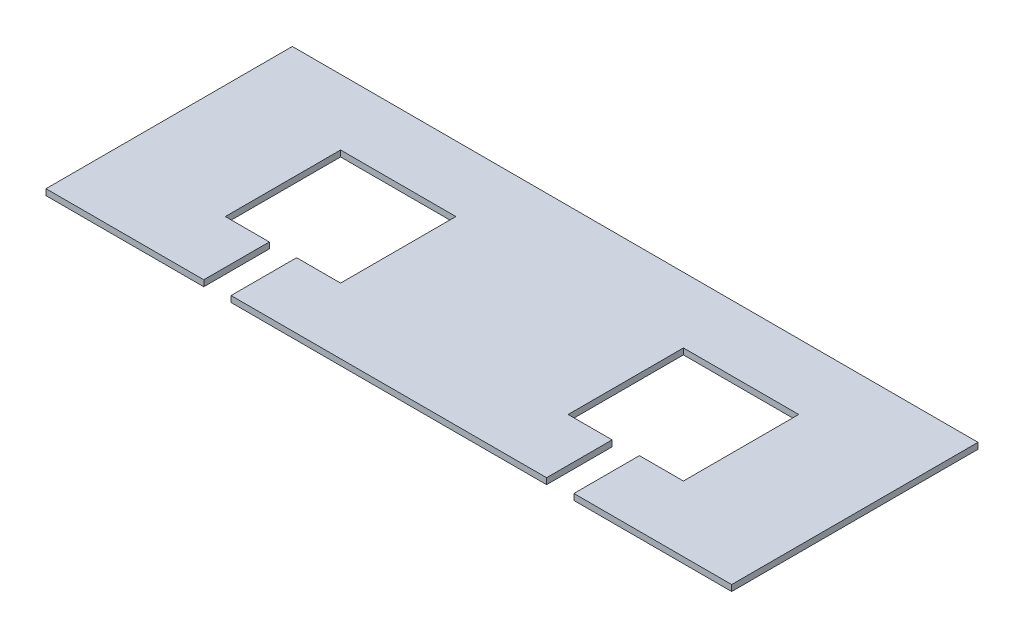
ISO-10303-21;
HEADER;
FILE_DESCRIPTION(('STEP AP214'),'2;1');
FILE_NAME('part.step','',(''),(''),'','','');
FILE_SCHEMA(('AUTOMOTIVE_DESIGN { 1 0 10303 214 1 1 1 1 }'));
ENDSEC;
DATA;
#1=APPLICATION_CONTEXT('core data for automotive mechanical design processes');
#2=APPLICATION_PROTOCOL_DEFINITION('international standard','automotive_design',2000,#1);
#3=PRODUCT_CONTEXT('',#1,'mechanical');
#4=PRODUCT('Part','Part','',(#3));
#5=PRODUCT_RELATED_PRODUCT_CATEGORY('part','',(#4));
#6=PRODUCT_DEFINITION_FORMATION('','',#4);
#7=PRODUCT_DEFINITION_CONTEXT('part definition',#1,'design');
#8=PRODUCT_DEFINITION('design','',#6,#7);
#9=PRODUCT_DEFINITION_SHAPE('','',#8);
#10=(LENGTH_UNIT() NAMED_UNIT(*) SI_UNIT(.MILLI.,.METRE.));
#11=(NAMED_UNIT(*) PLANE_ANGLE_UNIT() SI_UNIT($,.RADIAN.));
#12=(NAMED_UNIT(*) SI_UNIT($,.STERADIAN.) SOLID_ANGLE_UNIT());
#13=UNCERTAINTY_MEASURE_WITH_UNIT(LENGTH_MEASURE(1.E-05),#10,'distance_accuracy_value','');
#14=(GEOMETRIC_REPRESENTATION_CONTEXT(3) GLOBAL_UNCERTAINTY_ASSIGNED_CONTEXT((#13)) GLOBAL_UNIT_ASSIGNED_CONTEXT((#10,
#11,#12)) REPRESENTATION_CONTEXT('',''));
#15=CARTESIAN_POINT('',(0.,0.,0.));
#16=DIRECTION('',(0.,0.,1.));
#17=DIRECTION('',(1.,0.,0.));
#18=AXIS2_PLACEMENT_3D('',#15,#16,#17);
#19=CARTESIAN_POINT('',(0.,1.,0.));
#20=DIRECTION('',(0.,0.,-1.));
#21=DIRECTION('',(-1.,0.,0.));
#22=AXIS2_PLACEMENT_3D('',#19,#20,#21);
#23=PLANE('',#22);
#24=DIRECTION('',(0.,1.,0.));
#25=VECTOR('',#24,1.);
#26=CARTESIAN_POINT('',(87.,0.,0.));
#27=LINE('',#26,#25);
#28=CARTESIAN_POINT('',(87.,0.,0.));
#29=VERTEX_POINT('',#28);
#30=CARTESIAN_POINT('',(87.,1.,0.));
#31=VERTEX_POINT('',#30);
#32=EDGE_CURVE('E229',#29,#31,#27,.T.);
#33=ORIENTED_EDGE('',*,*,#32,.F.);
#34=DIRECTION('',(1.,0.,0.));
#35=VECTOR('',#34,1.);
#36=CARTESIAN_POINT('',(0.,0.,0.));
#37=LINE('',#36,#35);
#38=CARTESIAN_POINT('',(113.,0.,0.));
#39=VERTEX_POINT('',#38);
#40=EDGE_CURVE('E311',#29,#39,#37,.T.);
#41=ORIENTED_EDGE('',*,*,#40,.T.);
#42=DIRECTION('',(0.,-1.,0.));
#43=VECTOR('',#42,1.);
#44=CARTESIAN_POINT('',(113.,1.,0.));
#45=LINE('',#44,#43);
#46=CARTESIAN_POINT('',(113.,1.,0.));
#47=VERTEX_POINT('',#46);
#48=EDGE_CURVE('E45',#47,#39,#45,.T.);
#49=ORIENTED_EDGE('',*,*,#48,.F.);
#50=DIRECTION('',(1.,0.,0.));
#51=VECTOR('',#50,1.);
#52=CARTESIAN_POINT('',(0.,1.,0.));
#53=LINE('',#52,#51);
#54=EDGE_CURVE('E298',#31,#47,#53,.T.);
#55=ORIENTED_EDGE('',*,*,#54,.F.);
#56=EDGE_LOOP('',(#33,#41,#49,#55));
#57=FACE_BOUND('',#56,.T.);
#58=ADVANCED_FACE('F37',(#57),#23,.F.);
#59=DIRECTION('',(0.,1.,0.));
#60=VECTOR('',#59,1.);
#61=CARTESIAN_POINT('',(82.5,0.,0.));
#62=LINE('',#61,#60);
#63=CARTESIAN_POINT('',(82.5,0.,0.));
#64=VERTEX_POINT('',#63);
#65=CARTESIAN_POINT('',(82.5,1.,0.));
#66=VERTEX_POINT('',#65);
#67=EDGE_CURVE('E231',#64,#66,#62,.T.);
#68=ORIENTED_EDGE('',*,*,#67,.T.);
#69=CARTESIAN_POINT('',(30.5,1.,0.));
#70=VERTEX_POINT('',#69);
#71=EDGE_CURVE('E304',#70,#66,#53,.T.);
#72=ORIENTED_EDGE('',*,*,#71,.F.);
#73=DIRECTION('',(0.,1.,0.));
#74=VECTOR('',#73,1.);
#75=CARTESIAN_POINT('',(30.5,0.,0.));
#76=LINE('',#75,#74);
#77=CARTESIAN_POINT('',(30.5,0.,0.));
#78=VERTEX_POINT('',#77);
#79=EDGE_CURVE('E287',#78,#70,#76,.T.);
#80=ORIENTED_EDGE('',*,*,#79,.F.);
#81=EDGE_CURVE('E316',#78,#64,#37,.T.);
#82=ORIENTED_EDGE('',*,*,#81,.T.);
#83=EDGE_LOOP('',(#68,#72,#80,#82));
#84=FACE_BOUND('',#83,.T.);
#85=ADVANCED_FACE('F352',(#84),#23,.F.);
#86=CARTESIAN_POINT('',(0.,1.,0.));
#87=DIRECTION('',(0.,-1.,0.));
#88=DIRECTION('',(0.,0.,-1.));
#89=AXIS2_PLACEMENT_3D('',#86,#87,#88);
#90=PLANE('',#89);
#91=DIRECTION('',(0.,0.,1.));
#92=VECTOR('',#91,1.);
#93=CARTESIAN_POINT('',(87.,1.,-10.8));
#94=LINE('',#93,#92);
#95=CARTESIAN_POINT('',(87.,1.,-10.8));
#96=VERTEX_POINT('',#95);
#97=EDGE_CURVE('E199',#96,#31,#94,.T.);
#98=ORIENTED_EDGE('',*,*,#97,.T.);
#99=ORIENTED_EDGE('',*,*,#54,.T.);
#100=DIRECTION('',(0.,0.,-1.));
#101=VECTOR('',#100,1.);
#102=CARTESIAN_POINT('',(113.,1.,0.));
#103=LINE('',#102,#101);
#104=CARTESIAN_POINT('',(113.,1.,-40.6));
#105=VERTEX_POINT('',#104);
#106=EDGE_CURVE('E303',#47,#105,#103,.T.);
#107=ORIENTED_EDGE('',*,*,#106,.T.);
#108=DIRECTION('',(-1.,0.,0.));
#109=VECTOR('',#108,1.);
#110=CARTESIAN_POINT('',(0.,1.,-40.6));
#111=LINE('',#110,#109);
#112=CARTESIAN_POINT('',(0.,1.,-40.6));
#113=VERTEX_POINT('',#112);
#114=EDGE_CURVE('E306',#105,#113,#111,.T.);
#115=ORIENTED_EDGE('',*,*,#114,.T.);
#116=DIRECTION('',(0.,0.,1.));
#117=VECTOR('',#116,1.);
#118=CARTESIAN_POINT('',(0.,1.,0.));
#119=LINE('',#118,#117);
#120=CARTESIAN_POINT('',(0.,1.,0.));
#121=VERTEX_POINT('',#120);
#122=EDGE_CURVE('E295',#113,#121,#119,.T.);
#123=ORIENTED_EDGE('',*,*,#122,.T.);
#124=CARTESIAN_POINT('',(26.,1.,0.));
#125=VERTEX_POINT('',#124);
#126=EDGE_CURVE('E300',#121,#125,#53,.T.);
#127=ORIENTED_EDGE('',*,*,#126,.T.);
#128=DIRECTION('',(0.,0.,1.));
#129=VECTOR('',#128,1.);
#130=CARTESIAN_POINT('',(26.,1.,-10.8));
#131=LINE('',#130,#129);
#132=CARTESIAN_POINT('',(26.,1.,-10.8));
#133=VERTEX_POINT('',#132);
#134=EDGE_CURVE('E265',#133,#125,#131,.T.);
#135=ORIENTED_EDGE('',*,*,#134,.F.);
#136=DIRECTION('',(1.,0.,0.));
#137=VECTOR('',#136,1.);
#138=CARTESIAN_POINT('',(26.,1.,-10.8));
#139=LINE('',#138,#137);
#140=CARTESIAN_POINT('',(18.75,1.,-10.8));
#141=VERTEX_POINT('',#140);
#142=EDGE_CURVE('E262',#141,#133,#139,.T.);
#143=ORIENTED_EDGE('',*,*,#142,.F.);
#144=DIRECTION('',(0.,0.,1.));
#145=VECTOR('',#144,1.);
#146=CARTESIAN_POINT('',(18.75,1.,-10.8));
#147=LINE('',#146,#145);
#148=CARTESIAN_POINT('',(18.75,1.,-29.8));
#149=VERTEX_POINT('',#148);
#150=EDGE_CURVE('E226',#149,#141,#147,.T.);
#151=ORIENTED_EDGE('',*,*,#150,.F.);
#152=DIRECTION('',(-1.,0.,0.));
#153=VECTOR('',#152,1.);
#154=CARTESIAN_POINT('',(37.75,1.,-29.8));
#155=LINE('',#154,#153);
#156=CARTESIAN_POINT('',(37.75,1.,-29.8));
#157=VERTEX_POINT('',#156);
#158=EDGE_CURVE('E243',#157,#149,#155,.T.);
#159=ORIENTED_EDGE('',*,*,#158,.F.);
#160=DIRECTION('',(0.,0.,-1.));
#161=VECTOR('',#160,1.);
#162=CARTESIAN_POINT('',(37.75,1.,-10.8));
#163=LINE('',#162,#161);
#164=CARTESIAN_POINT('',(37.75,1.,-10.8));
#165=VERTEX_POINT('',#164);
#166=EDGE_CURVE('E273',#165,#157,#163,.T.);
#167=ORIENTED_EDGE('',*,*,#166,.F.);
#168=DIRECTION('',(1.,0.,0.));
#169=VECTOR('',#168,1.);
#170=CARTESIAN_POINT('',(37.75,1.,-10.8));
#171=LINE('',#170,#169);
#172=CARTESIAN_POINT('',(30.5,1.,-10.8));
#173=VERTEX_POINT('',#172);
#174=EDGE_CURVE('E270',#173,#165,#171,.T.);
#175=ORIENTED_EDGE('',*,*,#174,.F.);
#176=DIRECTION('',(0.,0.,-1.));
#177=VECTOR('',#176,1.);
#178=CARTESIAN_POINT('',(30.5,1.,-10.8));
#179=LINE('',#178,#177);
#180=EDGE_CURVE('E267',#70,#173,#179,.T.);
#181=ORIENTED_EDGE('',*,*,#180,.F.);
#182=ORIENTED_EDGE('',*,*,#71,.T.);
#183=DIRECTION('',(0.,0.,-1.));
#184=VECTOR('',#183,1.);
#185=CARTESIAN_POINT('',(82.5,1.,-10.8));
#186=LINE('',#185,#184);
#187=CARTESIAN_POINT('',(82.5,1.,-10.8));
#188=VERTEX_POINT('',#187);
#189=EDGE_CURVE('E219',#66,#188,#186,.T.);
#190=ORIENTED_EDGE('',*,*,#189,.T.);
#191=DIRECTION('',(-1.,0.,0.));
#192=VECTOR('',#191,1.);
#193=CARTESIAN_POINT('',(75.25,1.,-10.8));
#194=LINE('',#193,#192);
#195=CARTESIAN_POINT('',(75.25,1.,-10.8));
#196=VERTEX_POINT('',#195);
#197=EDGE_CURVE('E216',#188,#196,#194,.T.);
#198=ORIENTED_EDGE('',*,*,#197,.T.);
#199=DIRECTION('',(0.,0.,-1.));
#200=VECTOR('',#199,1.);
#201=CARTESIAN_POINT('',(75.25,1.,-10.8));
#202=LINE('',#201,#200);
#203=CARTESIAN_POINT('',(75.25,1.,-29.8));
#204=VERTEX_POINT('',#203);
#205=EDGE_CURVE('E213',#196,#204,#202,.T.);
#206=ORIENTED_EDGE('',*,*,#205,.T.);
#207=DIRECTION('',(1.,0.,0.));
#208=VECTOR('',#207,1.);
#209=CARTESIAN_POINT('',(75.25,1.,-29.8));
#210=LINE('',#209,#208);
#211=CARTESIAN_POINT('',(94.25,1.,-29.8));
#212=VERTEX_POINT('',#211);
#213=EDGE_CURVE('E211',#204,#212,#210,.T.);
#214=ORIENTED_EDGE('',*,*,#213,.T.);
#215=DIRECTION('',(0.,0.,1.));
#216=VECTOR('',#215,1.);
#217=CARTESIAN_POINT('',(94.25,1.,-10.8));
#218=LINE('',#217,#216);
#219=CARTESIAN_POINT('',(94.25,1.,-10.8));
#220=VERTEX_POINT('',#219);
#221=EDGE_CURVE('E188',#212,#220,#218,.T.);
#222=ORIENTED_EDGE('',*,*,#221,.T.);
#223=DIRECTION('',(-1.,0.,0.));
#224=VECTOR('',#223,1.);
#225=CARTESIAN_POINT('',(87.,1.,-10.8));
#226=LINE('',#225,#224);
#227=EDGE_CURVE('E196',#220,#96,#226,.T.);
#228=ORIENTED_EDGE('',*,*,#227,.T.);
#229=EDGE_LOOP('',(#98,#99,#107,#115,#123,#127,#135,#143,#151,#159,#167,#175,#181,#182,#190,
#198,#206,#214,#222,#228));
#230=FACE_BOUND('',#229,.T.);
#231=ADVANCED_FACE('F342',(#230),#90,.F.);
#232=CARTESIAN_POINT('',(0.,0.,0.));
#233=DIRECTION('',(0.,-1.,0.));
#234=DIRECTION('',(0.,0.,-1.));
#235=AXIS2_PLACEMENT_3D('',#232,#233,#234);
#236=PLANE('',#235);
#237=ORIENTED_EDGE('',*,*,#40,.F.);
#238=DIRECTION('',(0.,0.,1.));
#239=VECTOR('',#238,1.);
#240=CARTESIAN_POINT('',(87.,0.,-10.8));
#241=LINE('',#240,#239);
#242=CARTESIAN_POINT('',(87.,0.,-10.8));
#243=VERTEX_POINT('',#242);
#244=EDGE_CURVE('E207',#243,#29,#241,.T.);
#245=ORIENTED_EDGE('',*,*,#244,.F.);
#246=DIRECTION('',(-1.,0.,0.));
#247=VECTOR('',#246,1.);
#248=CARTESIAN_POINT('',(87.,0.,-10.8));
#249=LINE('',#248,#247);
#250=CARTESIAN_POINT('',(94.25,0.,-10.8));
#251=VERTEX_POINT('',#250);
#252=EDGE_CURVE('E190',#251,#243,#249,.T.);
#253=ORIENTED_EDGE('',*,*,#252,.F.);
#254=DIRECTION('',(0.,0.,1.));
#255=VECTOR('',#254,1.);
#256=CARTESIAN_POINT('',(94.25,0.,-10.8));
#257=LINE('',#256,#255);
#258=CARTESIAN_POINT('',(94.25,0.,-29.8));
#259=VERTEX_POINT('',#258);
#260=EDGE_CURVE('E181',#259,#251,#257,.T.);
#261=ORIENTED_EDGE('',*,*,#260,.F.);
#262=DIRECTION('',(1.,0.,0.));
#263=VECTOR('',#262,1.);
#264=CARTESIAN_POINT('',(75.25,0.,-29.8));
#265=LINE('',#264,#263);
#266=CARTESIAN_POINT('',(75.25,0.,-29.8));
#267=VERTEX_POINT('',#266);
#268=EDGE_CURVE('E172',#267,#259,#265,.T.);
#269=ORIENTED_EDGE('',*,*,#268,.F.);
#270=DIRECTION('',(0.,0.,-1.));
#271=VECTOR('',#270,1.);
#272=CARTESIAN_POINT('',(75.25,0.,-10.8));
#273=LINE('',#272,#271);
#274=CARTESIAN_POINT('',(75.25,0.,-10.8));
#275=VERTEX_POINT('',#274);
#276=EDGE_CURVE('E180',#275,#267,#273,.T.);
#277=ORIENTED_EDGE('',*,*,#276,.F.);
#278=DIRECTION('',(-1.,0.,0.));
#279=VECTOR('',#278,1.);
#280=CARTESIAN_POINT('',(75.25,0.,-10.8));
#281=LINE('',#280,#279);
#282=CARTESIAN_POINT('',(82.5,0.,-10.8));
#283=VERTEX_POINT('',#282);
#284=EDGE_CURVE('E203',#283,#275,#281,.T.);
#285=ORIENTED_EDGE('',*,*,#284,.F.);
#286=DIRECTION('',(0.,0.,-1.));
#287=VECTOR('',#286,1.);
#288=CARTESIAN_POINT('',(82.5,0.,-10.8));
#289=LINE('',#288,#287);
#290=EDGE_CURVE('E205',#64,#283,#289,.T.);
#291=ORIENTED_EDGE('',*,*,#290,.F.);
#292=ORIENTED_EDGE('',*,*,#81,.F.);
#293=DIRECTION('',(0.,0.,-1.));
#294=VECTOR('',#293,1.);
#295=CARTESIAN_POINT('',(30.5,0.,-10.8));
#296=LINE('',#295,#294);
#297=CARTESIAN_POINT('',(30.5,0.,-10.8));
#298=VERTEX_POINT('',#297);
#299=EDGE_CURVE('E247',#78,#298,#296,.T.);
#300=ORIENTED_EDGE('',*,*,#299,.T.);
#301=DIRECTION('',(1.,0.,0.));
#302=VECTOR('',#301,1.);
#303=CARTESIAN_POINT('',(37.75,0.,-10.8));
#304=LINE('',#303,#302);
#305=CARTESIAN_POINT('',(37.75,0.,-10.8));
#306=VERTEX_POINT('',#305);
#307=EDGE_CURVE('E250',#298,#306,#304,.T.);
#308=ORIENTED_EDGE('',*,*,#307,.T.);
#309=DIRECTION('',(0.,0.,-1.));
#310=VECTOR('',#309,1.);
#311=CARTESIAN_POINT('',(37.75,0.,-10.8));
#312=LINE('',#311,#310);
#313=CARTESIAN_POINT('',(37.75,0.,-29.8));
#314=VERTEX_POINT('',#313);
#315=EDGE_CURVE('E253',#306,#314,#312,.T.);
#316=ORIENTED_EDGE('',*,*,#315,.T.);
#317=DIRECTION('',(-1.,0.,0.));
#318=VECTOR('',#317,1.);
#319=CARTESIAN_POINT('',(37.75,0.,-29.8));
#320=LINE('',#319,#318);
#321=CARTESIAN_POINT('',(18.75,0.,-29.8));
#322=VERTEX_POINT('',#321);
#323=EDGE_CURVE('E256',#314,#322,#320,.T.);
#324=ORIENTED_EDGE('',*,*,#323,.T.);
#325=DIRECTION('',(0.,0.,1.));
#326=VECTOR('',#325,1.);
#327=CARTESIAN_POINT('',(18.75,0.,-10.8));
#328=LINE('',#327,#326);
#329=CARTESIAN_POINT('',(18.75,0.,-10.8));
#330=VERTEX_POINT('',#329);
#331=EDGE_CURVE('E239',#322,#330,#328,.T.);
#332=ORIENTED_EDGE('',*,*,#331,.T.);
#333=DIRECTION('',(1.,0.,0.));
#334=VECTOR('',#333,1.);
#335=CARTESIAN_POINT('',(26.,0.,-10.8));
#336=LINE('',#335,#334);
#337=CARTESIAN_POINT('',(26.,0.,-10.8));
#338=VERTEX_POINT('',#337);
#339=EDGE_CURVE('E242',#330,#338,#336,.T.);
#340=ORIENTED_EDGE('',*,*,#339,.T.);
#341=DIRECTION('',(0.,0.,1.));
#342=VECTOR('',#341,1.);
#343=CARTESIAN_POINT('',(26.,0.,-10.8));
#344=LINE('',#343,#342);
#345=CARTESIAN_POINT('',(26.,0.,0.));
#346=VERTEX_POINT('',#345);
#347=EDGE_CURVE('E60',#338,#346,#344,.T.);
#348=ORIENTED_EDGE('',*,*,#347,.T.);
#349=CARTESIAN_POINT('',(0.,0.,0.));
#350=VERTEX_POINT('',#349);
#351=EDGE_CURVE('E312',#350,#346,#37,.T.);
#352=ORIENTED_EDGE('',*,*,#351,.F.);
#353=DIRECTION('',(0.,0.,1.));
#354=VECTOR('',#353,1.);
#355=CARTESIAN_POINT('',(0.,0.,0.));
#356=LINE('',#355,#354);
#357=CARTESIAN_POINT('',(0.,0.,-40.6));
#358=VERTEX_POINT('',#357);
#359=EDGE_CURVE('E280',#358,#350,#356,.T.);
#360=ORIENTED_EDGE('',*,*,#359,.F.);
#361=DIRECTION('',(-1.,0.,0.));
#362=VECTOR('',#361,1.);
#363=CARTESIAN_POINT('',(0.,0.,-40.6));
#364=LINE('',#363,#362);
#365=CARTESIAN_POINT('',(113.,0.,-40.6));
#366=VERTEX_POINT('',#365);
#367=EDGE_CURVE('E299',#366,#358,#364,.T.);
#368=ORIENTED_EDGE('',*,*,#367,.F.);
#369=DIRECTION('',(0.,0.,-1.));
#370=VECTOR('',#369,1.);
#371=CARTESIAN_POINT('',(113.,0.,0.));
#372=LINE('',#371,#370);
#373=EDGE_CURVE('E315',#39,#366,#372,.T.);
#374=ORIENTED_EDGE('',*,*,#373,.F.);
#375=EDGE_LOOP('',(#237,#245,#253,#261,#269,#277,#285,#291,#292,#300,#308,#316,#324,#332,#340,
#348,#352,#360,#368,#374));
#376=FACE_BOUND('',#375,.T.);
#377=ADVANCED_FACE('F194',(#376),#236,.T.);
#378=CARTESIAN_POINT('',(0.,1.,0.));
#379=DIRECTION('',(1.,0.,0.));
#380=DIRECTION('',(0.,0.,-1.));
#381=AXIS2_PLACEMENT_3D('',#378,#379,#380);
#382=PLANE('',#381);
#383=ORIENTED_EDGE('',*,*,#359,.T.);
#384=DIRECTION('',(0.,-1.,0.));
#385=VECTOR('',#384,1.);
#386=CARTESIAN_POINT('',(0.,1.,0.));
#387=LINE('',#386,#385);
#388=EDGE_CURVE('E11',#121,#350,#387,.T.);
#389=ORIENTED_EDGE('',*,*,#388,.F.);
#390=ORIENTED_EDGE('',*,*,#122,.F.);
#391=DIRECTION('',(0.,-1.,0.));
#392=VECTOR('',#391,1.);
#393=CARTESIAN_POINT('',(0.,1.,-40.6));
#394=LINE('',#393,#392);
#395=EDGE_CURVE('E308',#113,#358,#394,.T.);
#396=ORIENTED_EDGE('',*,*,#395,.T.);
#397=EDGE_LOOP('',(#383,#389,#390,#396));
#398=FACE_BOUND('',#397,.T.);
#399=ADVANCED_FACE('F39',(#398),#382,.F.);
#400=ORIENTED_EDGE('',*,*,#351,.T.);
#401=DIRECTION('',(0.,1.,0.));
#402=VECTOR('',#401,1.);
#403=CARTESIAN_POINT('',(26.,0.,0.));
#404=LINE('',#403,#402);
#405=EDGE_CURVE('E289',#346,#125,#404,.T.);
#406=ORIENTED_EDGE('',*,*,#405,.T.);
#407=ORIENTED_EDGE('',*,*,#126,.F.);
#408=ORIENTED_EDGE('',*,*,#388,.T.);
#409=EDGE_LOOP('',(#400,#406,#407,#408));
#410=FACE_BOUND('',#409,.T.);
#411=ADVANCED_FACE('F373',(#410),#23,.F.);
#412=CARTESIAN_POINT('',(113.,1.,0.));
#413=DIRECTION('',(-1.,0.,0.));
#414=DIRECTION('',(0.,0.,1.));
#415=AXIS2_PLACEMENT_3D('',#412,#413,#414);
#416=PLANE('',#415);
#417=ORIENTED_EDGE('',*,*,#373,.T.);
#418=DIRECTION('',(0.,-1.,0.));
#419=VECTOR('',#418,1.);
#420=CARTESIAN_POINT('',(113.,1.,-40.6));
#421=LINE('',#420,#419);
#422=EDGE_CURVE('E321',#105,#366,#421,.T.);
#423=ORIENTED_EDGE('',*,*,#422,.F.);
#424=ORIENTED_EDGE('',*,*,#106,.F.);
#425=ORIENTED_EDGE('',*,*,#48,.T.);
#426=EDGE_LOOP('',(#417,#423,#424,#425));
#427=FACE_BOUND('',#426,.T.);
#428=ADVANCED_FACE('F328',(#427),#416,.F.);
#429=CARTESIAN_POINT('',(0.,1.,-40.6));
#430=DIRECTION('',(0.,0.,1.));
#431=DIRECTION('',(1.,0.,0.));
#432=AXIS2_PLACEMENT_3D('',#429,#430,#431);
#433=PLANE('',#432);
#434=ORIENTED_EDGE('',*,*,#367,.T.);
#435=ORIENTED_EDGE('',*,*,#395,.F.);
#436=ORIENTED_EDGE('',*,*,#114,.F.);
#437=ORIENTED_EDGE('',*,*,#422,.T.);
#438=EDGE_LOOP('',(#434,#435,#436,#437));
#439=FACE_BOUND('',#438,.T.);
#440=ADVANCED_FACE('F336',(#439),#433,.F.);
#441=CARTESIAN_POINT('',(18.75,0.,-10.8));
#442=DIRECTION('',(-1.,0.,0.));
#443=DIRECTION('',(0.,0.,1.));
#444=AXIS2_PLACEMENT_3D('',#441,#442,#443);
#445=PLANE('',#444);
#446=ORIENTED_EDGE('',*,*,#150,.T.);
#447=DIRECTION('',(0.,1.,0.));
#448=VECTOR('',#447,1.);
#449=CARTESIAN_POINT('',(18.75,0.,-10.8));
#450=LINE('',#449,#448);
#451=EDGE_CURVE('E259',#330,#141,#450,.T.);
#452=ORIENTED_EDGE('',*,*,#451,.F.);
#453=ORIENTED_EDGE('',*,*,#331,.F.);
#454=DIRECTION('',(0.,1.,0.));
#455=VECTOR('',#454,1.);
#456=CARTESIAN_POINT('',(18.75,0.,-29.8));
#457=LINE('',#456,#455);
#458=EDGE_CURVE('E278',#322,#149,#457,.T.);
#459=ORIENTED_EDGE('',*,*,#458,.T.);
#460=EDGE_LOOP('',(#446,#452,#453,#459));
#461=FACE_BOUND('',#460,.T.);
#462=ADVANCED_FACE('F394',(#461),#445,.F.);
#463=CARTESIAN_POINT('',(37.75,0.,-29.8));
#464=DIRECTION('',(0.,0.,-1.));
#465=DIRECTION('',(-1.,0.,0.));
#466=AXIS2_PLACEMENT_3D('',#463,#464,#465);
#467=PLANE('',#466);
#468=ORIENTED_EDGE('',*,*,#158,.T.);
#469=ORIENTED_EDGE('',*,*,#458,.F.);
#470=ORIENTED_EDGE('',*,*,#323,.F.);
#471=DIRECTION('',(0.,1.,0.));
#472=VECTOR('',#471,1.);
#473=CARTESIAN_POINT('',(37.75,0.,-29.8));
#474=LINE('',#473,#472);
#475=EDGE_CURVE('E281',#314,#157,#474,.T.);
#476=ORIENTED_EDGE('',*,*,#475,.T.);
#477=EDGE_LOOP('',(#468,#469,#470,#476));
#478=FACE_BOUND('',#477,.T.);
#479=ADVANCED_FACE('F397',(#478),#467,.F.);
#480=CARTESIAN_POINT('',(37.75,0.,-10.8));
#481=DIRECTION('',(1.,0.,0.));
#482=DIRECTION('',(0.,0.,-1.));
#483=AXIS2_PLACEMENT_3D('',#480,#481,#482);
#484=PLANE('',#483);
#485=ORIENTED_EDGE('',*,*,#166,.T.);
#486=ORIENTED_EDGE('',*,*,#475,.F.);
#487=ORIENTED_EDGE('',*,*,#315,.F.);
#488=DIRECTION('',(0.,1.,0.));
#489=VECTOR('',#488,1.);
#490=CARTESIAN_POINT('',(37.75,0.,-10.8));
#491=LINE('',#490,#489);
#492=EDGE_CURVE('E283',#306,#165,#491,.T.);
#493=ORIENTED_EDGE('',*,*,#492,.T.);
#494=EDGE_LOOP('',(#485,#486,#487,#493));
#495=FACE_BOUND('',#494,.T.);
#496=ADVANCED_FACE('F400',(#495),#484,.F.);
#497=CARTESIAN_POINT('',(37.75,0.,-10.8));
#498=DIRECTION('',(0.,0.,1.));
#499=DIRECTION('',(1.,0.,0.));
#500=AXIS2_PLACEMENT_3D('',#497,#498,#499);
#501=PLANE('',#500);
#502=ORIENTED_EDGE('',*,*,#174,.T.);
#503=ORIENTED_EDGE('',*,*,#492,.F.);
#504=ORIENTED_EDGE('',*,*,#307,.F.);
#505=DIRECTION('',(0.,1.,0.));
#506=VECTOR('',#505,1.);
#507=CARTESIAN_POINT('',(30.5,0.,-10.8));
#508=LINE('',#507,#506);
#509=EDGE_CURVE('E285',#298,#173,#508,.T.);
#510=ORIENTED_EDGE('',*,*,#509,.T.);
#511=EDGE_LOOP('',(#502,#503,#504,#510));
#512=FACE_BOUND('',#511,.T.);
#513=ADVANCED_FACE('F402',(#512),#501,.F.);
#514=CARTESIAN_POINT('',(30.5,0.,-10.8));
#515=DIRECTION('',(1.,0.,0.));
#516=DIRECTION('',(0.,0.,-1.));
#517=AXIS2_PLACEMENT_3D('',#514,#515,#516);
#518=PLANE('',#517);
#519=ORIENTED_EDGE('',*,*,#180,.T.);
#520=ORIENTED_EDGE('',*,*,#509,.F.);
#521=ORIENTED_EDGE('',*,*,#299,.F.);
#522=ORIENTED_EDGE('',*,*,#79,.T.);
#523=EDGE_LOOP('',(#519,#520,#521,#522));
#524=FACE_BOUND('',#523,.T.);
#525=ADVANCED_FACE('F405',(#524),#518,.F.);
#526=CARTESIAN_POINT('',(26.,0.,-10.8));
#527=DIRECTION('',(-1.,0.,0.));
#528=DIRECTION('',(0.,0.,1.));
#529=AXIS2_PLACEMENT_3D('',#526,#527,#528);
#530=PLANE('',#529);
#531=ORIENTED_EDGE('',*,*,#134,.T.);
#532=ORIENTED_EDGE('',*,*,#405,.F.);
#533=ORIENTED_EDGE('',*,*,#347,.F.);
#534=DIRECTION('',(0.,1.,0.));
#535=VECTOR('',#534,1.);
#536=CARTESIAN_POINT('',(26.,0.,-10.8));
#537=LINE('',#536,#535);
#538=EDGE_CURVE('E292',#338,#133,#537,.T.);
#539=ORIENTED_EDGE('',*,*,#538,.T.);
#540=EDGE_LOOP('',(#531,#532,#533,#539));
#541=FACE_BOUND('',#540,.T.);
#542=ADVANCED_FACE('F389',(#541),#530,.F.);
#543=CARTESIAN_POINT('',(26.,0.,-10.8));
#544=DIRECTION('',(0.,0.,1.));
#545=DIRECTION('',(1.,0.,0.));
#546=AXIS2_PLACEMENT_3D('',#543,#544,#545);
#547=PLANE('',#546);
#548=ORIENTED_EDGE('',*,*,#142,.T.);
#549=ORIENTED_EDGE('',*,*,#538,.F.);
#550=ORIENTED_EDGE('',*,*,#339,.F.);
#551=ORIENTED_EDGE('',*,*,#451,.T.);
#552=EDGE_LOOP('',(#548,#549,#550,#551));
#553=FACE_BOUND('',#552,.T.);
#554=ADVANCED_FACE('F387',(#553),#547,.F.);
#555=CARTESIAN_POINT('',(94.25,0.,-10.8));
#556=DIRECTION('',(-1.,0.,0.));
#557=DIRECTION('',(0.,0.,1.));
#558=AXIS2_PLACEMENT_3D('',#555,#556,#557);
#559=PLANE('',#558);
#560=ORIENTED_EDGE('',*,*,#221,.F.);
#561=DIRECTION('',(0.,1.,0.));
#562=VECTOR('',#561,1.);
#563=CARTESIAN_POINT('',(94.25,0.,-29.8));
#564=LINE('',#563,#562);
#565=EDGE_CURVE('E175',#259,#212,#564,.T.);
#566=ORIENTED_EDGE('',*,*,#565,.F.);
#567=ORIENTED_EDGE('',*,*,#260,.T.);
#568=DIRECTION('',(0.,1.,0.));
#569=VECTOR('',#568,1.);
#570=CARTESIAN_POINT('',(94.25,0.,-10.8));
#571=LINE('',#570,#569);
#572=EDGE_CURVE('E224',#251,#220,#571,.T.);
#573=ORIENTED_EDGE('',*,*,#572,.T.);
#574=EDGE_LOOP('',(#560,#566,#567,#573));
#575=FACE_BOUND('',#574,.T.);
#576=ADVANCED_FACE('F184',(#575),#559,.T.);
#577=CARTESIAN_POINT('',(87.,0.,-10.8));
#578=DIRECTION('',(0.,0.,-1.));
#579=DIRECTION('',(-1.,0.,0.));
#580=AXIS2_PLACEMENT_3D('',#577,#578,#579);
#581=PLANE('',#580);
#582=ORIENTED_EDGE('',*,*,#227,.F.);
#583=ORIENTED_EDGE('',*,*,#572,.F.);
#584=ORIENTED_EDGE('',*,*,#252,.T.);
#585=DIRECTION('',(0.,1.,0.));
#586=VECTOR('',#585,1.);
#587=CARTESIAN_POINT('',(87.,0.,-10.8));
#588=LINE('',#587,#586);
#589=EDGE_CURVE('E227',#243,#96,#588,.T.);
#590=ORIENTED_EDGE('',*,*,#589,.T.);
#591=EDGE_LOOP('',(#582,#583,#584,#590));
#592=FACE_BOUND('',#591,.T.);
#593=ADVANCED_FACE('F368',(#592),#581,.T.);
#594=CARTESIAN_POINT('',(87.,0.,-10.8));
#595=DIRECTION('',(-1.,0.,0.));
#596=DIRECTION('',(0.,0.,1.));
#597=AXIS2_PLACEMENT_3D('',#594,#595,#596);
#598=PLANE('',#597);
#599=ORIENTED_EDGE('',*,*,#97,.F.);
#600=ORIENTED_EDGE('',*,*,#589,.F.);
#601=ORIENTED_EDGE('',*,*,#244,.T.);
#602=ORIENTED_EDGE('',*,*,#32,.T.);
#603=EDGE_LOOP('',(#599,#600,#601,#602));
#604=FACE_BOUND('',#603,.T.);
#605=ADVANCED_FACE('F371',(#604),#598,.T.);
#606=CARTESIAN_POINT('',(82.5,0.,-10.8));
#607=DIRECTION('',(1.,0.,0.));
#608=DIRECTION('',(0.,0.,-1.));
#609=AXIS2_PLACEMENT_3D('',#606,#607,#608);
#610=PLANE('',#609);
#611=ORIENTED_EDGE('',*,*,#189,.F.);
#612=ORIENTED_EDGE('',*,*,#67,.F.);
#613=ORIENTED_EDGE('',*,*,#290,.T.);
#614=DIRECTION('',(0.,1.,0.));
#615=VECTOR('',#614,1.);
#616=CARTESIAN_POINT('',(82.5,0.,-10.8));
#617=LINE('',#616,#615);
#618=EDGE_CURVE('E234',#283,#188,#617,.T.);
#619=ORIENTED_EDGE('',*,*,#618,.T.);
#620=EDGE_LOOP('',(#611,#612,#613,#619));
#621=FACE_BOUND('',#620,.T.);
#622=ADVANCED_FACE('F357',(#621),#610,.T.);
#623=CARTESIAN_POINT('',(75.25,0.,-10.8));
#624=DIRECTION('',(0.,0.,-1.));
#625=DIRECTION('',(-1.,0.,0.));
#626=AXIS2_PLACEMENT_3D('',#623,#624,#625);
#627=PLANE('',#626);
#628=ORIENTED_EDGE('',*,*,#197,.F.);
#629=ORIENTED_EDGE('',*,*,#618,.F.);
#630=ORIENTED_EDGE('',*,*,#284,.T.);
#631=DIRECTION('',(0.,1.,0.));
#632=VECTOR('',#631,1.);
#633=CARTESIAN_POINT('',(75.25,0.,-10.8));
#634=LINE('',#633,#632);
#635=EDGE_CURVE('E236',#275,#196,#634,.T.);
#636=ORIENTED_EDGE('',*,*,#635,.T.);
#637=EDGE_LOOP('',(#628,#629,#630,#636));
#638=FACE_BOUND('',#637,.T.);
#639=ADVANCED_FACE('F363',(#638),#627,.T.);
#640=CARTESIAN_POINT('',(75.25,0.,-10.8));
#641=DIRECTION('',(1.,0.,0.));
#642=DIRECTION('',(0.,0.,-1.));
#643=AXIS2_PLACEMENT_3D('',#640,#641,#642);
#644=PLANE('',#643);
#645=ORIENTED_EDGE('',*,*,#205,.F.);
#646=ORIENTED_EDGE('',*,*,#635,.F.);
#647=ORIENTED_EDGE('',*,*,#276,.T.);
#648=DIRECTION('',(0.,1.,0.));
#649=VECTOR('',#648,1.);
#650=CARTESIAN_POINT('',(75.25,0.,-29.8));
#651=LINE('',#650,#649);
#652=EDGE_CURVE('E52',#267,#204,#651,.T.);
#653=ORIENTED_EDGE('',*,*,#652,.T.);
#654=EDGE_LOOP('',(#645,#646,#647,#653));
#655=FACE_BOUND('',#654,.T.);
#656=ADVANCED_FACE('F366',(#655),#644,.T.);
#657=CARTESIAN_POINT('',(75.25,0.,-29.8));
#658=DIRECTION('',(0.,0.,1.));
#659=DIRECTION('',(1.,0.,0.));
#660=AXIS2_PLACEMENT_3D('',#657,#658,#659);
#661=PLANE('',#660);
#662=ORIENTED_EDGE('',*,*,#213,.F.);
#663=ORIENTED_EDGE('',*,*,#652,.F.);
#664=ORIENTED_EDGE('',*,*,#268,.T.);
#665=ORIENTED_EDGE('',*,*,#565,.T.);
#666=EDGE_LOOP('',(#662,#663,#664,#665));
#667=FACE_BOUND('',#666,.T.);
#668=ADVANCED_FACE('F174',(#667),#661,.T.);
#669=CLOSED_SHELL('',(#58,#85,#231,#377,#399,#411,#428,#440,#462,#479,#496,#513,#525,#542,#554,
#576,#593,#605,#622,#639,#656,#668));
#670=MANIFOLD_SOLID_BREP('B2',#669);
#671=ADVANCED_BREP_SHAPE_REPRESENTATION('',(#18,#670),#14);
#672=SHAPE_DEFINITION_REPRESENTATION(#9,#671);
ENDSEC;
END-ISO-10303-21;
